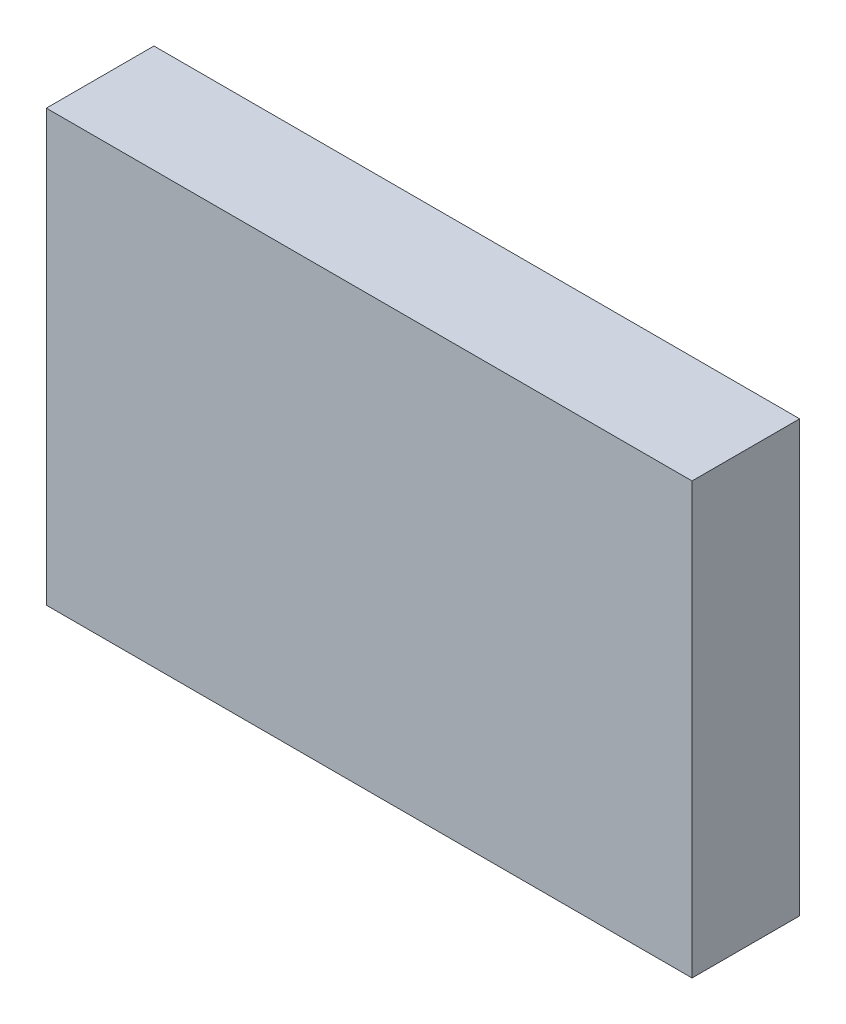
ISO-10303-21;
HEADER;
FILE_DESCRIPTION(('STEP AP214'),'2;1');
FILE_NAME('part.step','',(''),(''),'','','');
FILE_SCHEMA(('AUTOMOTIVE_DESIGN { 1 0 10303 214 1 1 1 1 }'));
ENDSEC;
DATA;
#1=APPLICATION_CONTEXT('core data for automotive mechanical design processes');
#2=APPLICATION_PROTOCOL_DEFINITION('international standard','automotive_design',2000,#1);
#3=PRODUCT_CONTEXT('',#1,'mechanical');
#4=PRODUCT('Part','Part','',(#3));
#5=PRODUCT_RELATED_PRODUCT_CATEGORY('part','',(#4));
#6=PRODUCT_DEFINITION_FORMATION('','',#4);
#7=PRODUCT_DEFINITION_CONTEXT('part definition',#1,'design');
#8=PRODUCT_DEFINITION('design','',#6,#7);
#9=PRODUCT_DEFINITION_SHAPE('','',#8);
#10=(LENGTH_UNIT() NAMED_UNIT(*) SI_UNIT(.MILLI.,.METRE.));
#11=(NAMED_UNIT(*) PLANE_ANGLE_UNIT() SI_UNIT($,.RADIAN.));
#12=(NAMED_UNIT(*) SI_UNIT($,.STERADIAN.) SOLID_ANGLE_UNIT());
#13=UNCERTAINTY_MEASURE_WITH_UNIT(LENGTH_MEASURE(1.E-05),#10,'distance_accuracy_value','');
#14=(GEOMETRIC_REPRESENTATION_CONTEXT(3) GLOBAL_UNCERTAINTY_ASSIGNED_CONTEXT((#13)) GLOBAL_UNIT_ASSIGNED_CONTEXT((#10,
#11,#12)) REPRESENTATION_CONTEXT('',''));
#15=CARTESIAN_POINT('',(0.,0.,0.));
#16=DIRECTION('',(0.,0.,1.));
#17=DIRECTION('',(1.,0.,0.));
#18=AXIS2_PLACEMENT_3D('',#15,#16,#17);
#19=CARTESIAN_POINT('',(18.,-9.22916666666667,-1.59722222222222));
#20=DIRECTION('',(0.,0.,1.));
#21=DIRECTION('',(1.,0.,0.));
#22=AXIS2_PLACEMENT_3D('',#19,#20,#21);
#23=PLANE('',#22);
#24=DIRECTION('',(0.,1.,0.));
#25=VECTOR('',#24,1.);
#26=CARTESIAN_POINT('',(0.,-9.22916666666667,-1.59722222222222));
#27=LINE('',#26,#25);
#28=CARTESIAN_POINT('',(0.,-9.22916666666667,-1.59722222222222));
#29=VERTEX_POINT('',#28);
#30=CARTESIAN_POINT('',(0.,2.77083333333333,-1.59722222222222));
#31=VERTEX_POINT('',#30);
#32=EDGE_CURVE('E113',#29,#31,#27,.T.);
#33=ORIENTED_EDGE('',*,*,#32,.T.);
#34=DIRECTION('',(-1.,0.,0.));
#35=VECTOR('',#34,1.);
#36=CARTESIAN_POINT('',(18.,2.77083333333333,-1.59722222222222));
#37=LINE('',#36,#35);
#38=CARTESIAN_POINT('',(18.,2.77083333333333,-1.59722222222222));
#39=VERTEX_POINT('',#38);
#40=EDGE_CURVE('E11',#39,#31,#37,.T.);
#41=ORIENTED_EDGE('',*,*,#40,.F.);
#42=DIRECTION('',(0.,1.,0.));
#43=VECTOR('',#42,1.);
#44=CARTESIAN_POINT('',(18.,-9.22916666666667,-1.59722222222222));
#45=LINE('',#44,#43);
#46=CARTESIAN_POINT('',(18.,-9.22916666666667,-1.59722222222222));
#47=VERTEX_POINT('',#46);
#48=EDGE_CURVE('E97',#47,#39,#45,.T.);
#49=ORIENTED_EDGE('',*,*,#48,.F.);
#50=DIRECTION('',(-1.,0.,0.));
#51=VECTOR('',#50,1.);
#52=CARTESIAN_POINT('',(18.,-9.22916666666667,-1.59722222222222));
#53=LINE('',#52,#51);
#54=EDGE_CURVE('E109',#47,#29,#53,.T.);
#55=ORIENTED_EDGE('',*,*,#54,.T.);
#56=EDGE_LOOP('',(#33,#41,#49,#55));
#57=FACE_BOUND('',#56,.T.);
#58=ADVANCED_FACE('F45',(#57),#23,.F.);
#59=CARTESIAN_POINT('',(18.,2.77083333333333,1.40277777777778));
#60=DIRECTION('',(0.,-1.,0.));
#61=DIRECTION('',(0.,0.,-1.));
#62=AXIS2_PLACEMENT_3D('',#59,#60,#61);
#63=PLANE('',#62);
#64=DIRECTION('',(0.,0.,1.));
#65=VECTOR('',#64,1.);
#66=CARTESIAN_POINT('',(0.,2.77083333333333,1.40277777777778));
#67=LINE('',#66,#65);
#68=CARTESIAN_POINT('',(0.,2.77083333333333,1.40277777777778));
#69=VERTEX_POINT('',#68);
#70=EDGE_CURVE('E102',#31,#69,#67,.T.);
#71=ORIENTED_EDGE('',*,*,#70,.T.);
#72=DIRECTION('',(-1.,0.,0.));
#73=VECTOR('',#72,1.);
#74=CARTESIAN_POINT('',(18.,2.77083333333333,1.40277777777778));
#75=LINE('',#74,#73);
#76=CARTESIAN_POINT('',(18.,2.77083333333333,1.40277777777778));
#77=VERTEX_POINT('',#76);
#78=EDGE_CURVE('E54',#77,#69,#75,.T.);
#79=ORIENTED_EDGE('',*,*,#78,.F.);
#80=DIRECTION('',(0.,0.,1.));
#81=VECTOR('',#80,1.);
#82=CARTESIAN_POINT('',(18.,2.77083333333333,1.40277777777778));
#83=LINE('',#82,#81);
#84=EDGE_CURVE('E92',#39,#77,#83,.T.);
#85=ORIENTED_EDGE('',*,*,#84,.F.);
#86=ORIENTED_EDGE('',*,*,#40,.T.);
#87=EDGE_LOOP('',(#71,#79,#85,#86));
#88=FACE_BOUND('',#87,.T.);
#89=ADVANCED_FACE('F101',(#88),#63,.F.);
#90=CARTESIAN_POINT('',(18.,-9.22916666666667,1.40277777777778));
#91=DIRECTION('',(0.,0.,-1.));
#92=DIRECTION('',(-1.,0.,0.));
#93=AXIS2_PLACEMENT_3D('',#90,#91,#92);
#94=PLANE('',#93);
#95=DIRECTION('',(0.,-1.,0.));
#96=VECTOR('',#95,1.);
#97=CARTESIAN_POINT('',(0.,-9.22916666666667,1.40277777777778));
#98=LINE('',#97,#96);
#99=CARTESIAN_POINT('',(0.,-9.22916666666667,1.40277777777778));
#100=VERTEX_POINT('',#99);
#101=EDGE_CURVE('E79',#69,#100,#98,.T.);
#102=ORIENTED_EDGE('',*,*,#101,.T.);
#103=DIRECTION('',(-1.,0.,0.));
#104=VECTOR('',#103,1.);
#105=CARTESIAN_POINT('',(18.,-9.22916666666667,1.40277777777778));
#106=LINE('',#105,#104);
#107=CARTESIAN_POINT('',(18.,-9.22916666666667,1.40277777777778));
#108=VERTEX_POINT('',#107);
#109=EDGE_CURVE('E104',#108,#100,#106,.T.);
#110=ORIENTED_EDGE('',*,*,#109,.F.);
#111=DIRECTION('',(0.,-1.,0.));
#112=VECTOR('',#111,1.);
#113=CARTESIAN_POINT('',(18.,-9.22916666666667,1.40277777777778));
#114=LINE('',#113,#112);
#115=EDGE_CURVE('E95',#77,#108,#114,.T.);
#116=ORIENTED_EDGE('',*,*,#115,.F.);
#117=ORIENTED_EDGE('',*,*,#78,.T.);
#118=EDGE_LOOP('',(#102,#110,#116,#117));
#119=FACE_BOUND('',#118,.T.);
#120=ADVANCED_FACE('F105',(#119),#94,.F.);
#121=CARTESIAN_POINT('',(18.,-9.22916666666667,1.40277777777778));
#122=DIRECTION('',(0.,1.,0.));
#123=DIRECTION('',(0.,0.,1.));
#124=AXIS2_PLACEMENT_3D('',#121,#122,#123);
#125=PLANE('',#124);
#126=DIRECTION('',(0.,0.,-1.));
#127=VECTOR('',#126,1.);
#128=CARTESIAN_POINT('',(0.,-9.22916666666667,1.40277777777778));
#129=LINE('',#128,#127);
#130=EDGE_CURVE('E85',#100,#29,#129,.T.);
#131=ORIENTED_EDGE('',*,*,#130,.T.);
#132=ORIENTED_EDGE('',*,*,#54,.F.);
#133=DIRECTION('',(0.,0.,-1.));
#134=VECTOR('',#133,1.);
#135=CARTESIAN_POINT('',(18.,-9.22916666666667,1.40277777777778));
#136=LINE('',#135,#134);
#137=EDGE_CURVE('E62',#108,#47,#136,.T.);
#138=ORIENTED_EDGE('',*,*,#137,.F.);
#139=ORIENTED_EDGE('',*,*,#109,.T.);
#140=EDGE_LOOP('',(#131,#132,#138,#139));
#141=FACE_BOUND('',#140,.T.);
#142=ADVANCED_FACE('F126',(#141),#125,.F.);
#143=CARTESIAN_POINT('',(18.,0.,0.));
#144=DIRECTION('',(-1.,0.,0.));
#145=DIRECTION('',(0.,0.,1.));
#146=AXIS2_PLACEMENT_3D('',#143,#144,#145);
#147=PLANE('',#146);
#148=ORIENTED_EDGE('',*,*,#48,.T.);
#149=ORIENTED_EDGE('',*,*,#84,.T.);
#150=ORIENTED_EDGE('',*,*,#115,.T.);
#151=ORIENTED_EDGE('',*,*,#137,.T.);
#152=EDGE_LOOP('',(#148,#149,#150,#151));
#153=FACE_BOUND('',#152,.T.);
#154=ADVANCED_FACE('F93',(#153),#147,.F.);
#155=CARTESIAN_POINT('',(0.,0.,0.));
#156=DIRECTION('',(-1.,0.,0.));
#157=DIRECTION('',(0.,0.,1.));
#158=AXIS2_PLACEMENT_3D('',#155,#156,#157);
#159=PLANE('',#158);
#160=ORIENTED_EDGE('',*,*,#32,.F.);
#161=ORIENTED_EDGE('',*,*,#130,.F.);
#162=ORIENTED_EDGE('',*,*,#101,.F.);
#163=ORIENTED_EDGE('',*,*,#70,.F.);
#164=EDGE_LOOP('',(#160,#161,#162,#163));
#165=FACE_BOUND('',#164,.T.);
#166=ADVANCED_FACE('F129',(#165),#159,.T.);
#167=CLOSED_SHELL('',(#58,#89,#120,#142,#154,#166));
#168=MANIFOLD_SOLID_BREP('B2',#167);
#169=ADVANCED_BREP_SHAPE_REPRESENTATION('',(#18,#168),#14);
#170=SHAPE_DEFINITION_REPRESENTATION(#9,#169);
ENDSEC;
END-ISO-10303-21;
